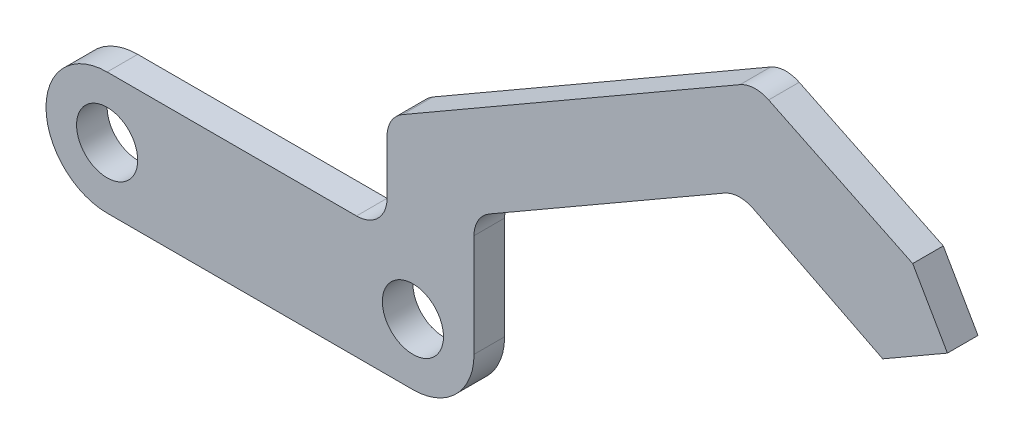
ISO-10303-21;
HEADER;
FILE_DESCRIPTION(('STEP AP214'),'2;1');
FILE_NAME('part.step','',(''),(''),'','','');
FILE_SCHEMA(('AUTOMOTIVE_DESIGN { 1 0 10303 214 1 1 1 1 }'));
ENDSEC;
DATA;
#1=APPLICATION_CONTEXT('core data for automotive mechanical design processes');
#2=APPLICATION_PROTOCOL_DEFINITION('international standard','automotive_design',2000,#1);
#3=PRODUCT_CONTEXT('',#1,'mechanical');
#4=PRODUCT('Part','Part','',(#3));
#5=PRODUCT_RELATED_PRODUCT_CATEGORY('part','',(#4));
#6=PRODUCT_DEFINITION_FORMATION('','',#4);
#7=PRODUCT_DEFINITION_CONTEXT('part definition',#1,'design');
#8=PRODUCT_DEFINITION('design','',#6,#7);
#9=PRODUCT_DEFINITION_SHAPE('','',#8);
#10=(LENGTH_UNIT() NAMED_UNIT(*) SI_UNIT(.MILLI.,.METRE.));
#11=(NAMED_UNIT(*) PLANE_ANGLE_UNIT() SI_UNIT($,.RADIAN.));
#12=(NAMED_UNIT(*) SI_UNIT($,.STERADIAN.) SOLID_ANGLE_UNIT());
#13=UNCERTAINTY_MEASURE_WITH_UNIT(LENGTH_MEASURE(1.E-05),#10,'distance_accuracy_value','');
#14=(GEOMETRIC_REPRESENTATION_CONTEXT(3) GLOBAL_UNCERTAINTY_ASSIGNED_CONTEXT((#13)) GLOBAL_UNIT_ASSIGNED_CONTEXT((#10,
#11,#12)) REPRESENTATION_CONTEXT('',''));
#15=CARTESIAN_POINT('',(0.,0.,0.));
#16=DIRECTION('',(0.,0.,1.));
#17=DIRECTION('',(1.,0.,0.));
#18=AXIS2_PLACEMENT_3D('',#15,#16,#17);
#19=CARTESIAN_POINT('',(30.017,0.,3.));
#20=DIRECTION('',(0.,0.,-1.));
#21=DIRECTION('',(-1.,0.,0.));
#22=AXIS2_PLACEMENT_3D('',#19,#20,#21);
#23=CYLINDRICAL_SURFACE('',#22,6.);
#24=CARTESIAN_POINT('',(30.017,0.,0.));
#25=DIRECTION('',(0.,0.,1.));
#26=DIRECTION('',(1.,0.,0.));
#27=AXIS2_PLACEMENT_3D('',#24,#25,#26);
#28=CIRCLE('',#27,6.);
#29=CARTESIAN_POINT('',(30.017,-6.,0.));
#30=VERTEX_POINT('',#29);
#31=CARTESIAN_POINT('',(36.017,0.,0.));
#32=VERTEX_POINT('',#31);
#33=EDGE_CURVE('E186',#30,#32,#28,.T.);
#34=ORIENTED_EDGE('',*,*,#33,.T.);
#35=DIRECTION('',(0.,0.,-1.));
#36=VECTOR('',#35,1.);
#37=CARTESIAN_POINT('',(36.017,0.,3.));
#38=LINE('',#37,#36);
#39=CARTESIAN_POINT('',(36.017,0.,3.));
#40=VERTEX_POINT('',#39);
#41=EDGE_CURVE('E165',#40,#32,#38,.T.);
#42=ORIENTED_EDGE('',*,*,#41,.F.);
#43=CARTESIAN_POINT('',(30.017,0.,3.));
#44=DIRECTION('',(0.,0.,1.));
#45=DIRECTION('',(1.,0.,0.));
#46=AXIS2_PLACEMENT_3D('',#43,#44,#45);
#47=CIRCLE('',#46,6.);
#48=CARTESIAN_POINT('',(30.017,-6.,3.));
#49=VERTEX_POINT('',#48);
#50=EDGE_CURVE('E173',#49,#40,#47,.T.);
#51=ORIENTED_EDGE('',*,*,#50,.F.);
#52=DIRECTION('',(0.,0.,-1.));
#53=VECTOR('',#52,1.);
#54=CARTESIAN_POINT('',(30.017,-6.,3.));
#55=LINE('',#54,#53);
#56=EDGE_CURVE('E310',#49,#30,#55,.T.);
#57=ORIENTED_EDGE('',*,*,#56,.T.);
#58=EDGE_LOOP('',(#34,#42,#51,#57));
#59=FACE_BOUND('',#58,.T.);
#60=ADVANCED_FACE('F41',(#59),#23,.T.);
#61=CARTESIAN_POINT('',(36.017,0.,3.));
#62=DIRECTION('',(-1.,0.,0.));
#63=DIRECTION('',(0.,-1.,0.));
#64=AXIS2_PLACEMENT_3D('',#61,#62,#63);
#65=PLANE('',#64);
#66=DIRECTION('',(0.,1.,0.));
#67=VECTOR('',#66,1.);
#68=CARTESIAN_POINT('',(36.017,0.,0.));
#69=LINE('',#68,#67);
#70=CARTESIAN_POINT('',(36.017,10.0892174991448,0.));
#71=VERTEX_POINT('',#70);
#72=EDGE_CURVE('E269',#32,#71,#69,.T.);
#73=ORIENTED_EDGE('',*,*,#72,.T.);
#74=DIRECTION('',(0.,0.,-1.));
#75=VECTOR('',#74,1.);
#76=CARTESIAN_POINT('',(36.017,10.0892174991448,3.));
#77=LINE('',#76,#75);
#78=CARTESIAN_POINT('',(36.017,10.0892174991448,3.));
#79=VERTEX_POINT('',#78);
#80=EDGE_CURVE('E168',#71,#79,#77,.F.);
#81=ORIENTED_EDGE('',*,*,#80,.T.);
#82=DIRECTION('',(0.,1.,0.));
#83=VECTOR('',#82,1.);
#84=CARTESIAN_POINT('',(36.017,0.,3.));
#85=LINE('',#84,#83);
#86=EDGE_CURVE('E160',#40,#79,#85,.T.);
#87=ORIENTED_EDGE('',*,*,#86,.F.);
#88=ORIENTED_EDGE('',*,*,#41,.T.);
#89=EDGE_LOOP('',(#73,#81,#87,#88));
#90=FACE_BOUND('',#89,.T.);
#91=ADVANCED_FACE('F163',(#90),#65,.F.);
#92=CARTESIAN_POINT('',(3.87636716994993,-6.7194805913094,3.));
#93=DIRECTION('',(-0.499697669650356,0.866199883944811,0.));
#94=DIRECTION('',(-0.866199883944811,-0.499697669650356,0.));
#95=AXIS2_PLACEMENT_3D('',#92,#93,#94);
#96=PLANE('',#95);
#97=DIRECTION('',(0.866199883944811,0.499697669650356,0.));
#98=VECTOR('',#97,1.);
#99=CARTESIAN_POINT('',(3.87636716994993,-6.7194805913094,3.));
#100=LINE('',#99,#98);
#101=CARTESIAN_POINT('',(37.5179069910489,12.6878171509793,3.));
#102=VERTEX_POINT('',#101);
#103=CARTESIAN_POINT('',(60.5992258261856,26.003082424219,3.));
#104=VERTEX_POINT('',#103);
#105=EDGE_CURVE('E172',#102,#104,#100,.T.);
#106=ORIENTED_EDGE('',*,*,#105,.F.);
#107=DIRECTION('',(0.,0.,-1.));
#108=VECTOR('',#107,1.);
#109=CARTESIAN_POINT('',(37.5179069910489,12.6878171509793,0.));
#110=LINE('',#109,#108);
#111=CARTESIAN_POINT('',(37.5179069910489,12.6878171509793,0.));
#112=VERTEX_POINT('',#111);
#113=EDGE_CURVE('E226',#102,#112,#110,.T.);
#114=ORIENTED_EDGE('',*,*,#113,.T.);
#115=DIRECTION('',(0.866199883944811,0.499697669650356,0.));
#116=VECTOR('',#115,1.);
#117=CARTESIAN_POINT('',(3.87636716994993,-6.7194805913094,0.));
#118=LINE('',#117,#116);
#119=CARTESIAN_POINT('',(60.5992258261856,26.003082424219,0.));
#120=VERTEX_POINT('',#119);
#121=EDGE_CURVE('E257',#112,#120,#118,.T.);
#122=ORIENTED_EDGE('',*,*,#121,.T.);
#123=DIRECTION('',(0.,0.,-1.));
#124=VECTOR('',#123,1.);
#125=CARTESIAN_POINT('',(60.5992258261856,26.003082424219,3.));
#126=LINE('',#125,#124);
#127=EDGE_CURVE('E223',#120,#104,#126,.F.);
#128=ORIENTED_EDGE('',*,*,#127,.T.);
#129=EDGE_LOOP('',(#106,#114,#122,#128));
#130=FACE_BOUND('',#129,.T.);
#131=ADVANCED_FACE('F265',(#130),#96,.F.);
#132=CARTESIAN_POINT('',(23.3679155044546,46.3086391781408,3.));
#133=DIRECTION('',(0.450504856756036,0.892773977017265,0.));
#134=DIRECTION('',(-0.892773977017265,0.450504856756036,0.));
#135=AXIS2_PLACEMENT_3D('',#132,#133,#134);
#136=PLANE('',#135);
#137=DIRECTION('',(0.892773977017265,-0.450504856756036,0.));
#138=VECTOR('',#137,1.);
#139=CARTESIAN_POINT('',(23.3679155044546,46.3086391781408,3.));
#140=LINE('',#139,#138);
#141=CARTESIAN_POINT('',(63.4498334054048,26.0828047034364,3.));
#142=VERTEX_POINT('',#141);
#143=CARTESIAN_POINT('',(76.1384579220182,19.6799668996441,3.));
#144=VERTEX_POINT('',#143);
#145=EDGE_CURVE('E274',#142,#144,#140,.T.);
#146=ORIENTED_EDGE('',*,*,#145,.F.);
#147=DIRECTION('',(0.,0.,-1.));
#148=VECTOR('',#147,1.);
#149=CARTESIAN_POINT('',(63.4498334054047,26.0828047034364,0.));
#150=LINE('',#149,#148);
#151=CARTESIAN_POINT('',(63.4498334054048,26.0828047034364,0.));
#152=VERTEX_POINT('',#151);
#153=EDGE_CURVE('E232',#142,#152,#150,.T.);
#154=ORIENTED_EDGE('',*,*,#153,.T.);
#155=DIRECTION('',(0.892773977017265,-0.450504856756036,0.));
#156=VECTOR('',#155,1.);
#157=CARTESIAN_POINT('',(23.3679155044546,46.3086391781408,0.));
#158=LINE('',#157,#156);
#159=CARTESIAN_POINT('',(76.1384579220182,19.6799668996441,0.));
#160=VERTEX_POINT('',#159);
#161=EDGE_CURVE('E259',#152,#160,#158,.T.);
#162=ORIENTED_EDGE('',*,*,#161,.T.);
#163=DIRECTION('',(0.,0.,-1.));
#164=VECTOR('',#163,1.);
#165=CARTESIAN_POINT('',(76.1384579220182,19.6799668996441,3.));
#166=LINE('',#165,#164);
#167=EDGE_CURVE('E189',#144,#160,#166,.T.);
#168=ORIENTED_EDGE('',*,*,#167,.F.);
#169=EDGE_LOOP('',(#146,#154,#162,#168));
#170=FACE_BOUND('',#169,.T.);
#171=ADVANCED_FACE('F277',(#170),#136,.F.);
#172=CARTESIAN_POINT('',(10.4933637114599,-18.1896994545066,3.));
#173=DIRECTION('',(-0.499697669650356,0.866199883944811,0.));
#174=DIRECTION('',(-0.866199883944811,-0.499697669650356,0.));
#175=AXIS2_PLACEMENT_3D('',#172,#173,#174);
#176=PLANE('',#175);
#177=DIRECTION('',(0.866199883944811,0.499697669650356,0.));
#178=VECTOR('',#177,1.);
#179=CARTESIAN_POINT('',(10.4933637114599,-18.1896994545066,0.));
#180=LINE('',#179,#178);
#181=CARTESIAN_POINT('',(82.4874686803316,23.3426156015417,0.));
#182=VERTEX_POINT('',#181);
#183=EDGE_CURVE('E325',#160,#182,#180,.T.);
#184=ORIENTED_EDGE('',*,*,#183,.T.);
#185=DIRECTION('',(0.,0.,-1.));
#186=VECTOR('',#185,1.);
#187=CARTESIAN_POINT('',(82.4874686803316,23.3426156015417,3.));
#188=LINE('',#187,#186);
#189=CARTESIAN_POINT('',(82.4874686803316,23.3426156015417,3.));
#190=VERTEX_POINT('',#189);
#191=EDGE_CURVE('E197',#190,#182,#188,.T.);
#192=ORIENTED_EDGE('',*,*,#191,.F.);
#193=DIRECTION('',(0.866199883944811,0.499697669650356,0.));
#194=VECTOR('',#193,1.);
#195=CARTESIAN_POINT('',(10.4933637114599,-18.1896994545066,3.));
#196=LINE('',#195,#194);
#197=EDGE_CURVE('E280',#144,#190,#196,.T.);
#198=ORIENTED_EDGE('',*,*,#197,.F.);
#199=ORIENTED_EDGE('',*,*,#167,.T.);
#200=EDGE_LOOP('',(#184,#192,#198,#199));
#201=FACE_BOUND('',#200,.T.);
#202=ADVANCED_FACE('F375',(#201),#176,.F.);
#203=CARTESIAN_POINT('',(71.9941049688717,41.5323150560483,3.));
#204=DIRECTION('',(-0.866199883944811,-0.499697669650357,0.));
#205=DIRECTION('',(0.499697669650357,-0.866199883944811,0.));
#206=AXIS2_PLACEMENT_3D('',#203,#204,#205);
#207=PLANE('',#206);
#208=DIRECTION('',(-0.499697669650357,0.866199883944811,0.));
#209=VECTOR('',#208,1.);
#210=CARTESIAN_POINT('',(71.9941049688717,41.5323150560483,0.));
#211=LINE('',#210,#209);
#212=CARTESIAN_POINT('',(79.0780197321781,29.2527177744671,0.));
#213=VERTEX_POINT('',#212);
#214=EDGE_CURVE('E328',#182,#213,#211,.T.);
#215=ORIENTED_EDGE('',*,*,#214,.T.);
#216=DIRECTION('',(0.,0.,-1.));
#217=VECTOR('',#216,1.);
#218=CARTESIAN_POINT('',(79.0780197321781,29.2527177744671,3.));
#219=LINE('',#218,#217);
#220=CARTESIAN_POINT('',(79.0780197321781,29.2527177744671,3.));
#221=VERTEX_POINT('',#220);
#222=EDGE_CURVE('E361',#221,#213,#219,.T.);
#223=ORIENTED_EDGE('',*,*,#222,.F.);
#224=DIRECTION('',(-0.499697669650357,0.866199883944811,0.));
#225=VECTOR('',#224,1.);
#226=CARTESIAN_POINT('',(71.9941049688717,41.5323150560483,3.));
#227=LINE('',#226,#225);
#228=EDGE_CURVE('E284',#190,#221,#227,.T.);
#229=ORIENTED_EDGE('',*,*,#228,.F.);
#230=ORIENTED_EDGE('',*,*,#191,.T.);
#231=EDGE_LOOP('',(#215,#223,#229,#230));
#232=FACE_BOUND('',#231,.T.);
#233=ADVANCED_FACE('F370',(#232),#207,.F.);
#234=CARTESIAN_POINT('',(26.4581509996593,54.7032201266743,3.));
#235=DIRECTION('',(0.435412253933604,0.900231175379113,0.));
#236=DIRECTION('',(-0.900231175379113,0.435412253933604,0.));
#237=AXIS2_PLACEMENT_3D('',#234,#235,#236);
#238=PLANE('',#237);
#239=DIRECTION('',(0.900231175379113,-0.435412253933604,0.));
#240=VECTOR('',#239,1.);
#241=CARTESIAN_POINT('',(26.4581509996593,54.7032201266743,0.));
#242=LINE('',#241,#240);
#243=CARTESIAN_POINT('',(64.9363407675506,36.0925834454164,0.));
#244=VERTEX_POINT('',#243);
#245=EDGE_CURVE('E332',#244,#213,#242,.T.);
#246=ORIENTED_EDGE('',*,*,#245,.F.);
#247=DIRECTION('',(0.,0.,-1.));
#248=VECTOR('',#247,1.);
#249=CARTESIAN_POINT('',(64.9363407675506,36.0925834454164,3.));
#250=LINE('',#249,#248);
#251=CARTESIAN_POINT('',(64.9363407675506,36.0925834454164,3.));
#252=VERTEX_POINT('',#251);
#253=EDGE_CURVE('E57',#244,#252,#250,.F.);
#254=ORIENTED_EDGE('',*,*,#253,.T.);
#255=DIRECTION('',(0.900231175379113,-0.435412253933604,0.));
#256=VECTOR('',#255,1.);
#257=CARTESIAN_POINT('',(26.4581509996593,54.7032201266743,3.));
#258=LINE('',#257,#256);
#259=EDGE_CURVE('E291',#252,#221,#258,.T.);
#260=ORIENTED_EDGE('',*,*,#259,.T.);
#261=ORIENTED_EDGE('',*,*,#222,.T.);
#262=EDGE_LOOP('',(#246,#254,#260,#261));
#263=FACE_BOUND('',#262,.T.);
#264=ADVANCED_FACE('F373',(#263),#238,.T.);
#265=CARTESIAN_POINT('',(-0.0640794709643792,0.11107842538353,3.));
#266=DIRECTION('',(-0.499697669650418,0.866199883944775,0.));
#267=DIRECTION('',(-0.866199883944775,-0.499697669650418,0.));
#268=AXIS2_PLACEMENT_3D('',#265,#266,#267);
#269=PLANE('',#268);
#270=DIRECTION('',(0.866199883944775,0.499697669650418,0.));
#271=VECTOR('',#270,1.);
#272=CARTESIAN_POINT('',(-0.0640794709643792,0.11107842538353,3.));
#273=LINE('',#272,#271);
#274=CARTESIAN_POINT('',(28.9794455066137,16.8658506422022,3.));
#275=VERTEX_POINT('',#274);
#276=CARTESIAN_POINT('',(62.1310109967985,35.9904895711134,3.));
#277=VERTEX_POINT('',#276);
#278=EDGE_CURVE('E294',#275,#277,#273,.T.);
#279=ORIENTED_EDGE('',*,*,#278,.T.);
#280=DIRECTION('',(0.,0.,-1.));
#281=VECTOR('',#280,1.);
#282=CARTESIAN_POINT('',(62.1310109967985,35.9904895711134,3.));
#283=LINE('',#282,#281);
#284=CARTESIAN_POINT('',(62.1310109967985,35.9904895711134,0.));
#285=VERTEX_POINT('',#284);
#286=EDGE_CURVE('E236',#277,#285,#283,.T.);
#287=ORIENTED_EDGE('',*,*,#286,.T.);
#288=DIRECTION('',(0.866199883944775,0.499697669650418,0.));
#289=VECTOR('',#288,1.);
#290=CARTESIAN_POINT('',(-0.0640794709643792,0.11107842538353,0.));
#291=LINE('',#290,#289);
#292=CARTESIAN_POINT('',(28.9794455066137,16.8658506422022,0.));
#293=VERTEX_POINT('',#292);
#294=EDGE_CURVE('E335',#293,#285,#291,.T.);
#295=ORIENTED_EDGE('',*,*,#294,.F.);
#296=DIRECTION('',(0.,0.,-1.));
#297=VECTOR('',#296,1.);
#298=CARTESIAN_POINT('',(28.9794455066137,16.8658506422022,3.));
#299=LINE('',#298,#297);
#300=EDGE_CURVE('E203',#293,#275,#299,.F.);
#301=ORIENTED_EDGE('',*,*,#300,.T.);
#302=EDGE_LOOP('',(#279,#287,#295,#301));
#303=FACE_BOUND('',#302,.T.);
#304=ADVANCED_FACE('F424',(#303),#269,.T.);
#305=CARTESIAN_POINT('',(27.478538515565,1.04868864866664E-13,3.));
#306=DIRECTION('',(-1.,0.,0.));
#307=DIRECTION('',(0.,-1.,0.));
#308=AXIS2_PLACEMENT_3D('',#305,#306,#307);
#309=PLANE('',#308);
#310=DIRECTION('',(0.,1.,0.));
#311=VECTOR('',#310,1.);
#312=CARTESIAN_POINT('',(27.478538515565,1.04868864866664E-13,0.));
#313=LINE('',#312,#311);
#314=CARTESIAN_POINT('',(27.478538515565,9.00000000000001,0.));
#315=VERTEX_POINT('',#314);
#316=CARTESIAN_POINT('',(27.478538515565,14.2672509903679,0.));
#317=VERTEX_POINT('',#316);
#318=EDGE_CURVE('E338',#315,#317,#313,.T.);
#319=ORIENTED_EDGE('',*,*,#318,.F.);
#320=DIRECTION('',(0.,0.,-1.));
#321=VECTOR('',#320,1.);
#322=CARTESIAN_POINT('',(27.478538515565,9.00000000000001,3.));
#323=LINE('',#322,#321);
#324=CARTESIAN_POINT('',(27.478538515565,9.00000000000001,3.));
#325=VERTEX_POINT('',#324);
#326=EDGE_CURVE('E214',#315,#325,#323,.F.);
#327=ORIENTED_EDGE('',*,*,#326,.T.);
#328=DIRECTION('',(0.,1.,0.));
#329=VECTOR('',#328,1.);
#330=CARTESIAN_POINT('',(27.478538515565,1.04868864866664E-13,3.));
#331=LINE('',#330,#329);
#332=CARTESIAN_POINT('',(27.478538515565,14.2672509903679,3.));
#333=VERTEX_POINT('',#332);
#334=EDGE_CURVE('E298',#325,#333,#331,.T.);
#335=ORIENTED_EDGE('',*,*,#334,.T.);
#336=DIRECTION('',(0.,0.,-1.));
#337=VECTOR('',#336,1.);
#338=CARTESIAN_POINT('',(27.478538515565,14.2672509903679,3.));
#339=LINE('',#338,#337);
#340=EDGE_CURVE('E188',#333,#317,#339,.T.);
#341=ORIENTED_EDGE('',*,*,#340,.T.);
#342=EDGE_LOOP('',(#319,#327,#335,#341));
#343=FACE_BOUND('',#342,.T.);
#344=ADVANCED_FACE('F458',(#343),#309,.T.);
#345=CARTESIAN_POINT('',(0.,6.,3.));
#346=DIRECTION('',(0.,1.,0.));
#347=DIRECTION('',(0.,0.,1.));
#348=AXIS2_PLACEMENT_3D('',#345,#346,#347);
#349=PLANE('',#348);
#350=DIRECTION('',(1.,0.,0.));
#351=VECTOR('',#350,1.);
#352=CARTESIAN_POINT('',(0.,6.,3.));
#353=LINE('',#352,#351);
#354=CARTESIAN_POINT('',(0.,6.,3.));
#355=VERTEX_POINT('',#354);
#356=CARTESIAN_POINT('',(24.478538515565,6.,3.));
#357=VERTEX_POINT('',#356);
#358=EDGE_CURVE('E301',#355,#357,#353,.T.);
#359=ORIENTED_EDGE('',*,*,#358,.T.);
#360=DIRECTION('',(0.,0.,-1.));
#361=VECTOR('',#360,1.);
#362=CARTESIAN_POINT('',(24.478538515565,6.,0.));
#363=LINE('',#362,#361);
#364=CARTESIAN_POINT('',(24.478538515565,6.,0.));
#365=VERTEX_POINT('',#364);
#366=EDGE_CURVE('E210',#357,#365,#363,.T.);
#367=ORIENTED_EDGE('',*,*,#366,.T.);
#368=DIRECTION('',(1.,0.,0.));
#369=VECTOR('',#368,1.);
#370=CARTESIAN_POINT('',(0.,6.,0.));
#371=LINE('',#370,#369);
#372=CARTESIAN_POINT('',(0.,6.,0.));
#373=VERTEX_POINT('',#372);
#374=EDGE_CURVE('E341',#373,#365,#371,.T.);
#375=ORIENTED_EDGE('',*,*,#374,.F.);
#376=DIRECTION('',(0.,0.,-1.));
#377=VECTOR('',#376,1.);
#378=CARTESIAN_POINT('',(0.,6.,3.));
#379=LINE('',#378,#377);
#380=EDGE_CURVE('E358',#355,#373,#379,.T.);
#381=ORIENTED_EDGE('',*,*,#380,.F.);
#382=EDGE_LOOP('',(#359,#367,#375,#381));
#383=FACE_BOUND('',#382,.T.);
#384=ADVANCED_FACE('F437',(#383),#349,.T.);
#385=CARTESIAN_POINT('',(0.,0.,3.));
#386=DIRECTION('',(0.,0.,-1.));
#387=DIRECTION('',(-1.,0.,0.));
#388=AXIS2_PLACEMENT_3D('',#385,#386,#387);
#389=CYLINDRICAL_SURFACE('',#388,6.);
#390=CARTESIAN_POINT('',(0.,0.,0.));
#391=DIRECTION('',(0.,0.,1.));
#392=DIRECTION('',(1.,0.,0.));
#393=AXIS2_PLACEMENT_3D('',#390,#391,#392);
#394=CIRCLE('',#393,6.);
#395=CARTESIAN_POINT('',(0.,-6.,0.));
#396=VERTEX_POINT('',#395);
#397=EDGE_CURVE('E345',#373,#396,#394,.T.);
#398=ORIENTED_EDGE('',*,*,#397,.T.);
#399=DIRECTION('',(0.,0.,-1.));
#400=VECTOR('',#399,1.);
#401=CARTESIAN_POINT('',(0.,-6.,3.));
#402=LINE('',#401,#400);
#403=CARTESIAN_POINT('',(0.,-6.,3.));
#404=VERTEX_POINT('',#403);
#405=EDGE_CURVE('E354',#404,#396,#402,.T.);
#406=ORIENTED_EDGE('',*,*,#405,.F.);
#407=CARTESIAN_POINT('',(0.,0.,3.));
#408=DIRECTION('',(0.,0.,1.));
#409=DIRECTION('',(1.,0.,0.));
#410=AXIS2_PLACEMENT_3D('',#407,#408,#409);
#411=CIRCLE('',#410,6.);
#412=EDGE_CURVE('E305',#355,#404,#411,.T.);
#413=ORIENTED_EDGE('',*,*,#412,.F.);
#414=ORIENTED_EDGE('',*,*,#380,.T.);
#415=EDGE_LOOP('',(#398,#406,#413,#414));
#416=FACE_BOUND('',#415,.T.);
#417=ADVANCED_FACE('F396',(#416),#389,.T.);
#418=CARTESIAN_POINT('',(0.,0.,3.));
#419=DIRECTION('',(0.,0.,-1.));
#420=DIRECTION('',(-1.,0.,0.));
#421=AXIS2_PLACEMENT_3D('',#418,#419,#420);
#422=CYLINDRICAL_SURFACE('',#421,3.);
#423=CARTESIAN_POINT('',(0.,0.,3.));
#424=DIRECTION('',(0.,0.,1.));
#425=DIRECTION('',(1.,0.,0.));
#426=AXIS2_PLACEMENT_3D('',#423,#424,#425);
#427=CIRCLE('',#426,3.);
#428=CARTESIAN_POINT('',(3.,0.,3.));
#429=VERTEX_POINT('',#428);
#430=EDGE_CURVE('E183',#429,#429,#427,.T.);
#431=ORIENTED_EDGE('',*,*,#430,.T.);
#432=EDGE_LOOP('',(#431));
#433=FACE_BOUND('',#432,.T.);
#434=CARTESIAN_POINT('',(0.,0.,0.));
#435=DIRECTION('',(0.,0.,1.));
#436=DIRECTION('',(1.,0.,0.));
#437=AXIS2_PLACEMENT_3D('',#434,#435,#436);
#438=CIRCLE('',#437,3.);
#439=CARTESIAN_POINT('',(3.,0.,0.));
#440=VERTEX_POINT('',#439);
#441=EDGE_CURVE('E315',#440,#440,#438,.T.);
#442=ORIENTED_EDGE('',*,*,#441,.F.);
#443=EDGE_LOOP('',(#442));
#444=FACE_BOUND('',#443,.T.);
#445=ADVANCED_FACE('F392',(#433,#444),#422,.F.);
#446=CARTESIAN_POINT('',(30.017,0.,3.));
#447=DIRECTION('',(0.,0.,-1.));
#448=DIRECTION('',(-1.,0.,0.));
#449=AXIS2_PLACEMENT_3D('',#446,#447,#448);
#450=CYLINDRICAL_SURFACE('',#449,3.);
#451=CARTESIAN_POINT('',(30.017,0.,3.));
#452=DIRECTION('',(0.,0.,1.));
#453=DIRECTION('',(1.,0.,0.));
#454=AXIS2_PLACEMENT_3D('',#451,#452,#453);
#455=CIRCLE('',#454,3.);
#456=CARTESIAN_POINT('',(33.017,0.,3.));
#457=VERTEX_POINT('',#456);
#458=EDGE_CURVE('E351',#457,#457,#455,.T.);
#459=ORIENTED_EDGE('',*,*,#458,.T.);
#460=EDGE_LOOP('',(#459));
#461=FACE_BOUND('',#460,.T.);
#462=CARTESIAN_POINT('',(30.017,0.,0.));
#463=DIRECTION('',(0.,0.,1.));
#464=DIRECTION('',(1.,0.,0.));
#465=AXIS2_PLACEMENT_3D('',#462,#463,#464);
#466=CIRCLE('',#465,3.);
#467=CARTESIAN_POINT('',(33.017,0.,0.));
#468=VERTEX_POINT('',#467);
#469=EDGE_CURVE('E311',#468,#468,#466,.T.);
#470=ORIENTED_EDGE('',*,*,#469,.F.);
#471=EDGE_LOOP('',(#470));
#472=FACE_BOUND('',#471,.T.);
#473=ADVANCED_FACE('F395',(#461,#472),#450,.F.);
#474=CARTESIAN_POINT('',(0.,-6.,3.));
#475=DIRECTION('',(0.,1.,0.));
#476=DIRECTION('',(0.,0.,1.));
#477=AXIS2_PLACEMENT_3D('',#474,#475,#476);
#478=PLANE('',#477);
#479=DIRECTION('',(1.,0.,0.));
#480=VECTOR('',#479,1.);
#481=CARTESIAN_POINT('',(0.,-6.,0.));
#482=LINE('',#481,#480);
#483=EDGE_CURVE('E348',#396,#30,#482,.T.);
#484=ORIENTED_EDGE('',*,*,#483,.T.);
#485=ORIENTED_EDGE('',*,*,#56,.F.);
#486=DIRECTION('',(1.,0.,0.));
#487=VECTOR('',#486,1.);
#488=CARTESIAN_POINT('',(0.,-6.,3.));
#489=LINE('',#488,#487);
#490=EDGE_CURVE('E178',#404,#49,#489,.T.);
#491=ORIENTED_EDGE('',*,*,#490,.F.);
#492=ORIENTED_EDGE('',*,*,#405,.T.);
#493=EDGE_LOOP('',(#484,#485,#491,#492));
#494=FACE_BOUND('',#493,.T.);
#495=ADVANCED_FACE('F400',(#494),#478,.F.);
#496=CARTESIAN_POINT('',(0.,0.,3.));
#497=DIRECTION('',(0.,0.,1.));
#498=DIRECTION('',(1.,0.,0.));
#499=AXIS2_PLACEMENT_3D('',#496,#497,#498);
#500=PLANE('',#499);
#501=ORIENTED_EDGE('',*,*,#458,.F.);
#502=EDGE_LOOP('',(#501));
#503=FACE_BOUND('',#502,.T.);
#504=ORIENTED_EDGE('',*,*,#430,.F.);
#505=EDGE_LOOP('',(#504));
#506=FACE_BOUND('',#505,.T.);
#507=ORIENTED_EDGE('',*,*,#259,.F.);
#508=CARTESIAN_POINT('',(63.6301040057498,33.3918899192791,3.));
#509=DIRECTION('',(0.,0.,1.));
#510=DIRECTION('',(1.,0.,0.));
#511=AXIS2_PLACEMENT_3D('',#508,#509,#510);
#512=CIRCLE('',#511,3.);
#513=EDGE_CURVE('E244',#252,#277,#512,.T.);
#514=ORIENTED_EDGE('',*,*,#513,.T.);
#515=ORIENTED_EDGE('',*,*,#278,.F.);
#516=CARTESIAN_POINT('',(30.478538515565,14.2672509903679,3.));
#517=DIRECTION('',(0.,0.,1.));
#518=DIRECTION('',(1.,0.,0.));
#519=AXIS2_PLACEMENT_3D('',#516,#517,#518);
#520=CIRCLE('',#519,3.);
#521=EDGE_CURVE('E206',#275,#333,#520,.T.);
#522=ORIENTED_EDGE('',*,*,#521,.T.);
#523=ORIENTED_EDGE('',*,*,#334,.F.);
#524=CARTESIAN_POINT('',(24.478538515565,9.,3.));
#525=DIRECTION('',(0.,0.,1.));
#526=DIRECTION('',(1.,0.,0.));
#527=AXIS2_PLACEMENT_3D('',#524,#525,#526);
#528=CIRCLE('',#527,3.);
#529=EDGE_CURVE('E220',#325,#357,#528,.F.);
#530=ORIENTED_EDGE('',*,*,#529,.T.);
#531=ORIENTED_EDGE('',*,*,#358,.F.);
#532=ORIENTED_EDGE('',*,*,#412,.T.);
#533=ORIENTED_EDGE('',*,*,#490,.T.);
#534=ORIENTED_EDGE('',*,*,#50,.T.);
#535=ORIENTED_EDGE('',*,*,#86,.T.);
#536=CARTESIAN_POINT('',(39.017,10.0892174991448,3.));
#537=DIRECTION('',(0.,0.,1.));
#538=DIRECTION('',(1.,0.,0.));
#539=AXIS2_PLACEMENT_3D('',#536,#537,#538);
#540=CIRCLE('',#539,3.);
#541=EDGE_CURVE('E250',#79,#102,#540,.F.);
#542=ORIENTED_EDGE('',*,*,#541,.T.);
#543=ORIENTED_EDGE('',*,*,#105,.T.);
#544=CARTESIAN_POINT('',(62.0983188351366,23.4044827723846,3.));
#545=DIRECTION('',(0.,0.,1.));
#546=DIRECTION('',(1.,0.,0.));
#547=AXIS2_PLACEMENT_3D('',#544,#545,#546);
#548=CIRCLE('',#547,3.);
#549=EDGE_CURVE('E11',#104,#142,#548,.F.);
#550=ORIENTED_EDGE('',*,*,#549,.T.);
#551=ORIENTED_EDGE('',*,*,#145,.T.);
#552=ORIENTED_EDGE('',*,*,#197,.T.);
#553=ORIENTED_EDGE('',*,*,#228,.T.);
#554=EDGE_LOOP('',(#507,#514,#515,#522,#523,#530,#531,#532,#533,#534,#535,#542,#543,#550,#551,
#552,#553));
#555=FACE_BOUND('',#554,.T.);
#556=ADVANCED_FACE('F176',(#503,#506,#555),#500,.T.);
#557=CARTESIAN_POINT('',(0.,0.,0.));
#558=DIRECTION('',(0.,0.,1.));
#559=DIRECTION('',(1.,0.,0.));
#560=AXIS2_PLACEMENT_3D('',#557,#558,#559);
#561=PLANE('',#560);
#562=ORIENTED_EDGE('',*,*,#469,.T.);
#563=EDGE_LOOP('',(#562));
#564=FACE_BOUND('',#563,.T.);
#565=ORIENTED_EDGE('',*,*,#441,.T.);
#566=EDGE_LOOP('',(#565));
#567=FACE_BOUND('',#566,.T.);
#568=ORIENTED_EDGE('',*,*,#294,.T.);
#569=CARTESIAN_POINT('',(63.6301040057498,33.3918899192791,0.));
#570=DIRECTION('',(0.,0.,1.));
#571=DIRECTION('',(1.,0.,0.));
#572=AXIS2_PLACEMENT_3D('',#569,#570,#571);
#573=CIRCLE('',#572,3.);
#574=EDGE_CURVE('E65',#285,#244,#573,.F.);
#575=ORIENTED_EDGE('',*,*,#574,.T.);
#576=ORIENTED_EDGE('',*,*,#245,.T.);
#577=ORIENTED_EDGE('',*,*,#214,.F.);
#578=ORIENTED_EDGE('',*,*,#183,.F.);
#579=ORIENTED_EDGE('',*,*,#161,.F.);
#580=CARTESIAN_POINT('',(62.0983188351366,23.4044827723846,0.));
#581=DIRECTION('',(0.,0.,1.));
#582=DIRECTION('',(1.,0.,0.));
#583=AXIS2_PLACEMENT_3D('',#580,#581,#582);
#584=CIRCLE('',#583,3.);
#585=EDGE_CURVE('E50',#152,#120,#584,.T.);
#586=ORIENTED_EDGE('',*,*,#585,.T.);
#587=ORIENTED_EDGE('',*,*,#121,.F.);
#588=CARTESIAN_POINT('',(39.017,10.0892174991448,0.));
#589=DIRECTION('',(0.,0.,1.));
#590=DIRECTION('',(1.,0.,0.));
#591=AXIS2_PLACEMENT_3D('',#588,#589,#590);
#592=CIRCLE('',#591,3.);
#593=EDGE_CURVE('E247',#112,#71,#592,.T.);
#594=ORIENTED_EDGE('',*,*,#593,.T.);
#595=ORIENTED_EDGE('',*,*,#72,.F.);
#596=ORIENTED_EDGE('',*,*,#33,.F.);
#597=ORIENTED_EDGE('',*,*,#483,.F.);
#598=ORIENTED_EDGE('',*,*,#397,.F.);
#599=ORIENTED_EDGE('',*,*,#374,.T.);
#600=CARTESIAN_POINT('',(24.478538515565,9.,0.));
#601=DIRECTION('',(0.,0.,1.));
#602=DIRECTION('',(1.,0.,0.));
#603=AXIS2_PLACEMENT_3D('',#600,#601,#602);
#604=CIRCLE('',#603,3.);
#605=EDGE_CURVE('E217',#365,#315,#604,.T.);
#606=ORIENTED_EDGE('',*,*,#605,.T.);
#607=ORIENTED_EDGE('',*,*,#318,.T.);
#608=CARTESIAN_POINT('',(30.478538515565,14.2672509903679,0.));
#609=DIRECTION('',(0.,0.,1.));
#610=DIRECTION('',(1.,0.,0.));
#611=AXIS2_PLACEMENT_3D('',#608,#609,#610);
#612=CIRCLE('',#611,3.);
#613=EDGE_CURVE('E194',#317,#293,#612,.F.);
#614=ORIENTED_EDGE('',*,*,#613,.T.);
#615=EDGE_LOOP('',(#568,#575,#576,#577,#578,#579,#586,#587,#594,#595,#596,#597,#598,#599,#606,
#607,#614));
#616=FACE_BOUND('',#615,.T.);
#617=ADVANCED_FACE('F256',(#564,#567,#616),#561,.F.);
#618=CARTESIAN_POINT('',(30.478538515565,14.2672509903679,3.));
#619=DIRECTION('',(0.,0.,-1.));
#620=DIRECTION('',(-1.,0.,0.));
#621=AXIS2_PLACEMENT_3D('',#618,#619,#620);
#622=CYLINDRICAL_SURFACE('',#621,3.);
#623=ORIENTED_EDGE('',*,*,#521,.F.);
#624=ORIENTED_EDGE('',*,*,#300,.F.);
#625=ORIENTED_EDGE('',*,*,#613,.F.);
#626=ORIENTED_EDGE('',*,*,#340,.F.);
#627=EDGE_LOOP('',(#623,#624,#625,#626));
#628=FACE_BOUND('',#627,.T.);
#629=ADVANCED_FACE('F402',(#628),#622,.T.);
#630=CARTESIAN_POINT('',(24.478538515565,9.,3.));
#631=DIRECTION('',(0.,0.,1.));
#632=DIRECTION('',(1.,0.,0.));
#633=AXIS2_PLACEMENT_3D('',#630,#631,#632);
#634=CYLINDRICAL_SURFACE('',#633,3.);
#635=ORIENTED_EDGE('',*,*,#529,.F.);
#636=ORIENTED_EDGE('',*,*,#326,.F.);
#637=ORIENTED_EDGE('',*,*,#605,.F.);
#638=ORIENTED_EDGE('',*,*,#366,.F.);
#639=EDGE_LOOP('',(#635,#636,#637,#638));
#640=FACE_BOUND('',#639,.T.);
#641=ADVANCED_FACE('F405',(#640),#634,.F.);
#642=CARTESIAN_POINT('',(39.017,10.0892174991448,3.));
#643=DIRECTION('',(0.,0.,1.));
#644=DIRECTION('',(1.,0.,0.));
#645=AXIS2_PLACEMENT_3D('',#642,#643,#644);
#646=CYLINDRICAL_SURFACE('',#645,3.);
#647=ORIENTED_EDGE('',*,*,#541,.F.);
#648=ORIENTED_EDGE('',*,*,#80,.F.);
#649=ORIENTED_EDGE('',*,*,#593,.F.);
#650=ORIENTED_EDGE('',*,*,#113,.F.);
#651=EDGE_LOOP('',(#647,#648,#649,#650));
#652=FACE_BOUND('',#651,.T.);
#653=ADVANCED_FACE('F409',(#652),#646,.F.);
#654=CARTESIAN_POINT('',(62.0983188351366,23.4044827723846,3.));
#655=DIRECTION('',(0.,0.,1.));
#656=DIRECTION('',(1.,0.,0.));
#657=AXIS2_PLACEMENT_3D('',#654,#655,#656);
#658=CYLINDRICAL_SURFACE('',#657,3.);
#659=ORIENTED_EDGE('',*,*,#549,.F.);
#660=ORIENTED_EDGE('',*,*,#127,.F.);
#661=ORIENTED_EDGE('',*,*,#585,.F.);
#662=ORIENTED_EDGE('',*,*,#153,.F.);
#663=EDGE_LOOP('',(#659,#660,#661,#662));
#664=FACE_BOUND('',#663,.T.);
#665=ADVANCED_FACE('F272',(#664),#658,.F.);
#666=CARTESIAN_POINT('',(63.6301040057498,33.3918899192791,3.));
#667=DIRECTION('',(0.,0.,-1.));
#668=DIRECTION('',(-1.,0.,0.));
#669=AXIS2_PLACEMENT_3D('',#666,#667,#668);
#670=CYLINDRICAL_SURFACE('',#669,3.);
#671=ORIENTED_EDGE('',*,*,#513,.F.);
#672=ORIENTED_EDGE('',*,*,#253,.F.);
#673=ORIENTED_EDGE('',*,*,#574,.F.);
#674=ORIENTED_EDGE('',*,*,#286,.F.);
#675=EDGE_LOOP('',(#671,#672,#673,#674));
#676=FACE_BOUND('',#675,.T.);
#677=ADVANCED_FACE('F43',(#676),#670,.T.);
#678=CLOSED_SHELL('',(#60,#91,#131,#171,#202,#233,#264,#304,#344,#384,#417,#445,#473,#495,#556,
#617,#629,#641,#653,#665,#677));
#679=MANIFOLD_SOLID_BREP('B2',#678);
#680=ADVANCED_BREP_SHAPE_REPRESENTATION('',(#18,#679),#14);
#681=SHAPE_DEFINITION_REPRESENTATION(#9,#680);
ENDSEC;
END-ISO-10303-21;
